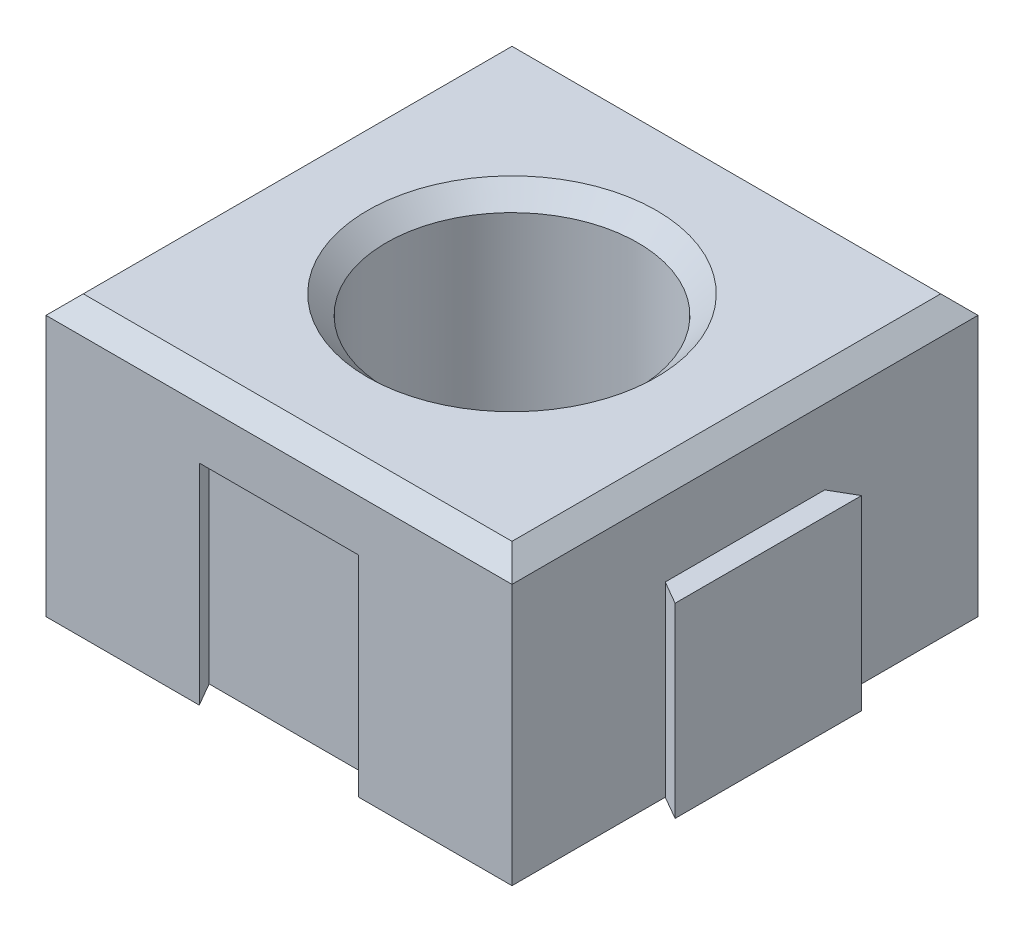
ISO-10303-21;
HEADER;
FILE_DESCRIPTION(('STEP AP214'),'2;1');
FILE_NAME('part.step','',(''),(''),'','','');
FILE_SCHEMA(('AUTOMOTIVE_DESIGN { 1 0 10303 214 1 1 1 1 }'));
ENDSEC;
DATA;
#1=APPLICATION_CONTEXT('core data for automotive mechanical design processes');
#2=APPLICATION_PROTOCOL_DEFINITION('international standard','automotive_design',2000,#1);
#3=PRODUCT_CONTEXT('',#1,'mechanical');
#4=PRODUCT('Part','Part','',(#3));
#5=PRODUCT_RELATED_PRODUCT_CATEGORY('part','',(#4));
#6=PRODUCT_DEFINITION_FORMATION('','',#4);
#7=PRODUCT_DEFINITION_CONTEXT('part definition',#1,'design');
#8=PRODUCT_DEFINITION('design','',#6,#7);
#9=PRODUCT_DEFINITION_SHAPE('','',#8);
#10=(LENGTH_UNIT() NAMED_UNIT(*) SI_UNIT(.MILLI.,.METRE.));
#11=(NAMED_UNIT(*) PLANE_ANGLE_UNIT() SI_UNIT($,.RADIAN.));
#12=(NAMED_UNIT(*) SI_UNIT($,.STERADIAN.) SOLID_ANGLE_UNIT());
#13=UNCERTAINTY_MEASURE_WITH_UNIT(LENGTH_MEASURE(1.E-05),#10,'distance_accuracy_value','');
#14=(GEOMETRIC_REPRESENTATION_CONTEXT(3) GLOBAL_UNCERTAINTY_ASSIGNED_CONTEXT((#13)) GLOBAL_UNIT_ASSIGNED_CONTEXT((#10,
#11,#12)) REPRESENTATION_CONTEXT('',''));
#15=CARTESIAN_POINT('',(0.,0.,0.));
#16=DIRECTION('',(0.,0.,1.));
#17=DIRECTION('',(1.,0.,0.));
#18=AXIS2_PLACEMENT_3D('',#15,#16,#17);
#19=CARTESIAN_POINT('',(0.,30.,-50.));
#20=DIRECTION('',(0.,0.,1.));
#21=DIRECTION('',(1.,0.,0.));
#22=AXIS2_PLACEMENT_3D('',#19,#20,#21);
#23=PLANE('',#22);
#24=DIRECTION('',(0.,-1.,0.));
#25=VECTOR('',#24,1.);
#26=CARTESIAN_POINT('',(0.,30.,-50.));
#27=LINE('',#26,#25);
#28=CARTESIAN_POINT('',(0.,28.,-50.));
#29=VERTEX_POINT('',#28);
#30=CARTESIAN_POINT('',(0.,0.,-50.));
#31=VERTEX_POINT('',#30);
#32=EDGE_CURVE('E326',#29,#31,#27,.T.);
#33=ORIENTED_EDGE('',*,*,#32,.F.);
#34=DIRECTION('',(1.,0.,0.));
#35=VECTOR('',#34,1.);
#36=CARTESIAN_POINT('',(0.,28.,-50.));
#37=LINE('',#36,#35);
#38=CARTESIAN_POINT('',(50.,28.,-50.));
#39=VERTEX_POINT('',#38);
#40=EDGE_CURVE('E346',#29,#39,#37,.T.);
#41=ORIENTED_EDGE('',*,*,#40,.T.);
#42=DIRECTION('',(0.,-1.,0.));
#43=VECTOR('',#42,1.);
#44=CARTESIAN_POINT('',(50.,30.,-50.));
#45=LINE('',#44,#43);
#46=CARTESIAN_POINT('',(50.,0.,-50.));
#47=VERTEX_POINT('',#46);
#48=EDGE_CURVE('E328',#39,#47,#45,.T.);
#49=ORIENTED_EDGE('',*,*,#48,.T.);
#50=DIRECTION('',(-1.,0.,0.));
#51=VECTOR('',#50,1.);
#52=CARTESIAN_POINT('',(0.,0.,-50.));
#53=LINE('',#52,#51);
#54=CARTESIAN_POINT('',(33.556624327026,0.,-50.));
#55=VERTEX_POINT('',#54);
#56=EDGE_CURVE('E323',#47,#55,#53,.T.);
#57=ORIENTED_EDGE('',*,*,#56,.T.);
#58=DIRECTION('',(0.,-1.,0.));
#59=VECTOR('',#58,1.);
#60=CARTESIAN_POINT('',(33.556624327026,20.,-50.));
#61=LINE('',#60,#59);
#62=CARTESIAN_POINT('',(33.556624327026,20.,-50.));
#63=VERTEX_POINT('',#62);
#64=EDGE_CURVE('E276',#63,#55,#61,.T.);
#65=ORIENTED_EDGE('',*,*,#64,.F.);
#66=DIRECTION('',(-1.,0.,0.));
#67=VECTOR('',#66,1.);
#68=CARTESIAN_POINT('',(33.556624327026,20.,-50.));
#69=LINE('',#68,#67);
#70=CARTESIAN_POINT('',(16.443375672974,20.,-50.));
#71=VERTEX_POINT('',#70);
#72=EDGE_CURVE('E261',#63,#71,#69,.T.);
#73=ORIENTED_EDGE('',*,*,#72,.T.);
#74=DIRECTION('',(0.,-1.,0.));
#75=VECTOR('',#74,1.);
#76=CARTESIAN_POINT('',(16.443375672974,20.,-50.));
#77=LINE('',#76,#75);
#78=CARTESIAN_POINT('',(16.443375672974,0.,-50.));
#79=VERTEX_POINT('',#78);
#80=EDGE_CURVE('E272',#71,#79,#77,.T.);
#81=ORIENTED_EDGE('',*,*,#80,.T.);
#82=EDGE_CURVE('E322',#79,#31,#53,.T.);
#83=ORIENTED_EDGE('',*,*,#82,.T.);
#84=EDGE_LOOP('',(#33,#41,#49,#57,#65,#73,#81,#83));
#85=FACE_BOUND('',#84,.T.);
#86=ADVANCED_FACE('F35',(#85),#23,.F.);
#87=CARTESIAN_POINT('',(50.,30.,0.));
#88=DIRECTION('',(-1.,0.,0.));
#89=DIRECTION('',(0.,0.,1.));
#90=AXIS2_PLACEMENT_3D('',#87,#88,#89);
#91=PLANE('',#90);
#92=ORIENTED_EDGE('',*,*,#48,.F.);
#93=DIRECTION('',(0.,0.,1.));
#94=VECTOR('',#93,1.);
#95=CARTESIAN_POINT('',(50.,28.,0.));
#96=LINE('',#95,#94);
#97=CARTESIAN_POINT('',(50.,28.,0.));
#98=VERTEX_POINT('',#97);
#99=EDGE_CURVE('E349',#39,#98,#96,.T.);
#100=ORIENTED_EDGE('',*,*,#99,.T.);
#101=DIRECTION('',(0.,-1.,0.));
#102=VECTOR('',#101,1.);
#103=CARTESIAN_POINT('',(50.,30.,0.));
#104=LINE('',#103,#102);
#105=CARTESIAN_POINT('',(50.,0.,0.));
#106=VERTEX_POINT('',#105);
#107=EDGE_CURVE('E330',#98,#106,#104,.T.);
#108=ORIENTED_EDGE('',*,*,#107,.T.);
#109=DIRECTION('',(0.,0.,-1.));
#110=VECTOR('',#109,1.);
#111=CARTESIAN_POINT('',(50.,0.,0.));
#112=LINE('',#111,#110);
#113=CARTESIAN_POINT('',(50.,0.,-16.443375672974));
#114=VERTEX_POINT('',#113);
#115=EDGE_CURVE('E319',#106,#114,#112,.T.);
#116=ORIENTED_EDGE('',*,*,#115,.T.);
#117=DIRECTION('',(0.,-1.,0.));
#118=VECTOR('',#117,1.);
#119=CARTESIAN_POINT('',(50.,20.,-16.443375672974));
#120=LINE('',#119,#118);
#121=CARTESIAN_POINT('',(50.,20.,-16.443375672974));
#122=VERTEX_POINT('',#121);
#123=EDGE_CURVE('E305',#122,#114,#120,.T.);
#124=ORIENTED_EDGE('',*,*,#123,.F.);
#125=DIRECTION('',(0.,0.,-1.));
#126=VECTOR('',#125,1.);
#127=CARTESIAN_POINT('',(50.,20.,-16.443375672974));
#128=LINE('',#127,#126);
#129=CARTESIAN_POINT('',(50.,20.,-33.556624327026));
#130=VERTEX_POINT('',#129);
#131=EDGE_CURVE('E290',#122,#130,#128,.T.);
#132=ORIENTED_EDGE('',*,*,#131,.T.);
#133=DIRECTION('',(0.,-1.,0.));
#134=VECTOR('',#133,1.);
#135=CARTESIAN_POINT('',(50.,20.,-33.556624327026));
#136=LINE('',#135,#134);
#137=CARTESIAN_POINT('',(50.,0.,-33.556624327026));
#138=VERTEX_POINT('',#137);
#139=EDGE_CURVE('E301',#130,#138,#136,.T.);
#140=ORIENTED_EDGE('',*,*,#139,.T.);
#141=EDGE_CURVE('E318',#138,#47,#112,.T.);
#142=ORIENTED_EDGE('',*,*,#141,.T.);
#143=EDGE_LOOP('',(#92,#100,#108,#116,#124,#132,#140,#142));
#144=FACE_BOUND('',#143,.T.);
#145=ADVANCED_FACE('F442',(#144),#91,.F.);
#146=CARTESIAN_POINT('',(0.,30.,0.));
#147=DIRECTION('',(1.,0.,0.));
#148=DIRECTION('',(0.,0.,-1.));
#149=AXIS2_PLACEMENT_3D('',#146,#147,#148);
#150=PLANE('',#149);
#151=DIRECTION('',(0.,0.,1.));
#152=VECTOR('',#151,1.);
#153=CARTESIAN_POINT('',(0.,22.5,-16.4433756729741));
#154=LINE('',#153,#152);
#155=CARTESIAN_POINT('',(0.,22.5,-33.5566243270259));
#156=VERTEX_POINT('',#155);
#157=CARTESIAN_POINT('',(0.,22.5,-16.4433756729741));
#158=VERTEX_POINT('',#157);
#159=EDGE_CURVE('E205',#156,#158,#154,.T.);
#160=ORIENTED_EDGE('',*,*,#159,.T.);
#161=DIRECTION('',(0.,-1.,0.));
#162=VECTOR('',#161,1.);
#163=CARTESIAN_POINT('',(0.,20.,-16.4433756729741));
#164=LINE('',#163,#162);
#165=CARTESIAN_POINT('',(0.,0.,-16.4433756729741));
#166=VERTEX_POINT('',#165);
#167=EDGE_CURVE('E245',#158,#166,#164,.T.);
#168=ORIENTED_EDGE('',*,*,#167,.T.);
#169=DIRECTION('',(0.,0.,1.));
#170=VECTOR('',#169,1.);
#171=CARTESIAN_POINT('',(0.,0.,0.));
#172=LINE('',#171,#170);
#173=CARTESIAN_POINT('',(0.,0.,0.));
#174=VERTEX_POINT('',#173);
#175=EDGE_CURVE('E312',#166,#174,#172,.T.);
#176=ORIENTED_EDGE('',*,*,#175,.T.);
#177=DIRECTION('',(0.,-1.,0.));
#178=VECTOR('',#177,1.);
#179=CARTESIAN_POINT('',(0.,30.,0.));
#180=LINE('',#179,#178);
#181=CARTESIAN_POINT('',(0.,28.,0.));
#182=VERTEX_POINT('',#181);
#183=EDGE_CURVE('E332',#182,#174,#180,.T.);
#184=ORIENTED_EDGE('',*,*,#183,.F.);
#185=DIRECTION('',(0.,0.,-1.));
#186=VECTOR('',#185,1.);
#187=CARTESIAN_POINT('',(0.,28.,0.));
#188=LINE('',#187,#186);
#189=EDGE_CURVE('E353',#182,#29,#188,.T.);
#190=ORIENTED_EDGE('',*,*,#189,.T.);
#191=ORIENTED_EDGE('',*,*,#32,.T.);
#192=CARTESIAN_POINT('',(0.,0.,-33.5566243270259));
#193=VERTEX_POINT('',#192);
#194=EDGE_CURVE('E313',#31,#193,#172,.T.);
#195=ORIENTED_EDGE('',*,*,#194,.T.);
#196=DIRECTION('',(0.,-1.,0.));
#197=VECTOR('',#196,1.);
#198=CARTESIAN_POINT('',(0.,20.,-33.5566243270259));
#199=LINE('',#198,#197);
#200=EDGE_CURVE('E242',#156,#193,#199,.T.);
#201=ORIENTED_EDGE('',*,*,#200,.F.);
#202=EDGE_LOOP('',(#160,#168,#176,#184,#190,#191,#195,#201));
#203=FACE_BOUND('',#202,.T.);
#204=ADVANCED_FACE('F449',(#203),#150,.F.);
#205=CARTESIAN_POINT('',(0.,30.,0.));
#206=DIRECTION('',(0.,0.,-1.));
#207=DIRECTION('',(-1.,0.,0.));
#208=AXIS2_PLACEMENT_3D('',#205,#206,#207);
#209=PLANE('',#208);
#210=DIRECTION('',(1.,0.,0.));
#211=VECTOR('',#210,1.);
#212=CARTESIAN_POINT('',(33.556624327026,22.5,0.));
#213=LINE('',#212,#211);
#214=CARTESIAN_POINT('',(16.4433756729741,22.5,0.));
#215=VERTEX_POINT('',#214);
#216=CARTESIAN_POINT('',(33.556624327026,22.5,0.));
#217=VERTEX_POINT('',#216);
#218=EDGE_CURVE('E203',#215,#217,#213,.T.);
#219=ORIENTED_EDGE('',*,*,#218,.T.);
#220=DIRECTION('',(0.,-1.,0.));
#221=VECTOR('',#220,1.);
#222=CARTESIAN_POINT('',(33.556624327026,20.,0.));
#223=LINE('',#222,#221);
#224=CARTESIAN_POINT('',(33.556624327026,0.,0.));
#225=VERTEX_POINT('',#224);
#226=EDGE_CURVE('E51',#217,#225,#223,.T.);
#227=ORIENTED_EDGE('',*,*,#226,.T.);
#228=DIRECTION('',(1.,0.,0.));
#229=VECTOR('',#228,1.);
#230=CARTESIAN_POINT('',(0.,0.,0.));
#231=LINE('',#230,#229);
#232=EDGE_CURVE('E225',#225,#106,#231,.T.);
#233=ORIENTED_EDGE('',*,*,#232,.T.);
#234=ORIENTED_EDGE('',*,*,#107,.F.);
#235=DIRECTION('',(-1.,0.,0.));
#236=VECTOR('',#235,1.);
#237=CARTESIAN_POINT('',(0.,28.,0.));
#238=LINE('',#237,#236);
#239=EDGE_CURVE('E351',#98,#182,#238,.T.);
#240=ORIENTED_EDGE('',*,*,#239,.T.);
#241=ORIENTED_EDGE('',*,*,#183,.T.);
#242=CARTESIAN_POINT('',(16.4433756729741,0.,0.));
#243=VERTEX_POINT('',#242);
#244=EDGE_CURVE('E316',#174,#243,#231,.T.);
#245=ORIENTED_EDGE('',*,*,#244,.T.);
#246=DIRECTION('',(0.,-1.,0.));
#247=VECTOR('',#246,1.);
#248=CARTESIAN_POINT('',(16.4433756729741,20.,0.));
#249=LINE('',#248,#247);
#250=EDGE_CURVE('E59',#215,#243,#249,.T.);
#251=ORIENTED_EDGE('',*,*,#250,.F.);
#252=EDGE_LOOP('',(#219,#227,#233,#234,#240,#241,#245,#251));
#253=FACE_BOUND('',#252,.T.);
#254=ADVANCED_FACE('F456',(#253),#209,.F.);
#255=CARTESIAN_POINT('',(0.,30.,0.));
#256=DIRECTION('',(0.,-1.,0.));
#257=DIRECTION('',(0.,0.,-1.));
#258=AXIS2_PLACEMENT_3D('',#255,#256,#257);
#259=PLANE('',#258);
#260=DIRECTION('',(0.,0.,-1.));
#261=VECTOR('',#260,1.);
#262=CARTESIAN_POINT('',(48.,30.,0.));
#263=LINE('',#262,#261);
#264=CARTESIAN_POINT('',(48.,30.,-2.00000000000001));
#265=VERTEX_POINT('',#264);
#266=CARTESIAN_POINT('',(48.,30.,-48.));
#267=VERTEX_POINT('',#266);
#268=EDGE_CURVE('E341',#265,#267,#263,.T.);
#269=ORIENTED_EDGE('',*,*,#268,.T.);
#270=DIRECTION('',(-1.,0.,0.));
#271=VECTOR('',#270,1.);
#272=CARTESIAN_POINT('',(0.,30.,-48.));
#273=LINE('',#272,#271);
#274=CARTESIAN_POINT('',(2.00000000000001,30.,-48.));
#275=VERTEX_POINT('',#274);
#276=EDGE_CURVE('E343',#267,#275,#273,.T.);
#277=ORIENTED_EDGE('',*,*,#276,.T.);
#278=DIRECTION('',(0.,0.,1.));
#279=VECTOR('',#278,1.);
#280=CARTESIAN_POINT('',(2.00000000000001,30.,0.));
#281=LINE('',#280,#279);
#282=CARTESIAN_POINT('',(2.00000000000001,30.,-2.00000000000001));
#283=VERTEX_POINT('',#282);
#284=EDGE_CURVE('E337',#275,#283,#281,.T.);
#285=ORIENTED_EDGE('',*,*,#284,.T.);
#286=DIRECTION('',(1.,0.,0.));
#287=VECTOR('',#286,1.);
#288=CARTESIAN_POINT('',(0.,30.,-2.00000000000001));
#289=LINE('',#288,#287);
#290=EDGE_CURVE('E339',#283,#265,#289,.T.);
#291=ORIENTED_EDGE('',*,*,#290,.T.);
#292=EDGE_LOOP('',(#269,#277,#285,#291));
#293=FACE_BOUND('',#292,.T.);
#294=CARTESIAN_POINT('',(25.,30.,-25.));
#295=DIRECTION('',(0.,-1.,0.));
#296=DIRECTION('',(0.,0.,-1.));
#297=AXIS2_PLACEMENT_3D('',#294,#295,#296);
#298=CIRCLE('',#297,15.5000000000001);
#299=CARTESIAN_POINT('',(25.,30.,-40.5000000000001));
#300=VERTEX_POINT('',#299);
#301=EDGE_CURVE('E334',#300,#300,#298,.T.);
#302=ORIENTED_EDGE('',*,*,#301,.T.);
#303=EDGE_LOOP('',(#302));
#304=FACE_BOUND('',#303,.T.);
#305=ADVANCED_FACE('F459',(#293,#304),#259,.F.);
#306=CARTESIAN_POINT('',(0.,0.,0.));
#307=DIRECTION('',(0.,-1.,0.));
#308=DIRECTION('',(0.,0.,-1.));
#309=AXIS2_PLACEMENT_3D('',#306,#307,#308);
#310=PLANE('',#309);
#311=CARTESIAN_POINT('',(12.5,0.,-12.5));
#312=DIRECTION('',(0.,1.,0.));
#313=DIRECTION('',(0.,0.,1.));
#314=AXIS2_PLACEMENT_3D('',#311,#312,#313);
#315=CIRCLE('',#314,3.1);
#316=CARTESIAN_POINT('',(12.5,0.,-9.4));
#317=VERTEX_POINT('',#316);
#318=EDGE_CURVE('E416',#317,#317,#315,.T.);
#319=ORIENTED_EDGE('',*,*,#318,.T.);
#320=EDGE_LOOP('',(#319));
#321=FACE_BOUND('',#320,.T.);
#322=CARTESIAN_POINT('',(37.5,0.,-12.5));
#323=DIRECTION('',(0.,1.,0.));
#324=DIRECTION('',(0.,0.,1.));
#325=AXIS2_PLACEMENT_3D('',#322,#323,#324);
#326=CIRCLE('',#325,3.1);
#327=CARTESIAN_POINT('',(37.5,0.,-9.4));
#328=VERTEX_POINT('',#327);
#329=EDGE_CURVE('E411',#328,#328,#326,.T.);
#330=ORIENTED_EDGE('',*,*,#329,.T.);
#331=EDGE_LOOP('',(#330));
#332=FACE_BOUND('',#331,.T.);
#333=CARTESIAN_POINT('',(37.5,0.,-37.5));
#334=DIRECTION('',(0.,1.,0.));
#335=DIRECTION('',(0.,0.,1.));
#336=AXIS2_PLACEMENT_3D('',#333,#334,#335);
#337=CIRCLE('',#336,3.1);
#338=CARTESIAN_POINT('',(37.5,0.,-34.4));
#339=VERTEX_POINT('',#338);
#340=EDGE_CURVE('E409',#339,#339,#337,.T.);
#341=ORIENTED_EDGE('',*,*,#340,.T.);
#342=EDGE_LOOP('',(#341));
#343=FACE_BOUND('',#342,.T.);
#344=CARTESIAN_POINT('',(12.5,0.,-37.5));
#345=DIRECTION('',(0.,1.,0.));
#346=DIRECTION('',(0.,0.,1.));
#347=AXIS2_PLACEMENT_3D('',#344,#345,#346);
#348=CIRCLE('',#347,3.1);
#349=CARTESIAN_POINT('',(12.5,0.,-34.4));
#350=VERTEX_POINT('',#349);
#351=EDGE_CURVE('E362',#350,#350,#348,.T.);
#352=ORIENTED_EDGE('',*,*,#351,.T.);
#353=EDGE_LOOP('',(#352));
#354=FACE_BOUND('',#353,.T.);
#355=DIRECTION('',(-0.499999999999995,0.,-0.866025403784441));
#356=VECTOR('',#355,1.);
#357=CARTESIAN_POINT('',(16.4433756729741,0.,0.));
#358=LINE('',#357,#356);
#359=CARTESIAN_POINT('',(15.,0.,-2.5));
#360=VERTEX_POINT('',#359);
#361=EDGE_CURVE('E190',#243,#360,#358,.T.);
#362=ORIENTED_EDGE('',*,*,#361,.F.);
#363=ORIENTED_EDGE('',*,*,#244,.F.);
#364=ORIENTED_EDGE('',*,*,#175,.F.);
#365=DIRECTION('',(-0.866025403784438,0.,-0.500000000000001));
#366=VECTOR('',#365,1.);
#367=CARTESIAN_POINT('',(2.5,0.,-15.));
#368=LINE('',#367,#366);
#369=CARTESIAN_POINT('',(2.5,0.,-15.));
#370=VERTEX_POINT('',#369);
#371=EDGE_CURVE('E236',#370,#166,#368,.T.);
#372=ORIENTED_EDGE('',*,*,#371,.F.);
#373=DIRECTION('',(0.,0.,1.));
#374=VECTOR('',#373,1.);
#375=CARTESIAN_POINT('',(2.5,0.,-35.));
#376=LINE('',#375,#374);
#377=CARTESIAN_POINT('',(2.5,0.,-35.));
#378=VERTEX_POINT('',#377);
#379=EDGE_CURVE('E238',#378,#370,#376,.T.);
#380=ORIENTED_EDGE('',*,*,#379,.F.);
#381=DIRECTION('',(0.866025403784438,0.,-0.500000000000001));
#382=VECTOR('',#381,1.);
#383=CARTESIAN_POINT('',(0.,0.,-33.5566243270259));
#384=LINE('',#383,#382);
#385=EDGE_CURVE('E230',#193,#378,#384,.T.);
#386=ORIENTED_EDGE('',*,*,#385,.F.);
#387=ORIENTED_EDGE('',*,*,#194,.F.);
#388=ORIENTED_EDGE('',*,*,#82,.F.);
#389=DIRECTION('',(-0.499999999999989,0.,-0.866025403784445));
#390=VECTOR('',#389,1.);
#391=CARTESIAN_POINT('',(16.443375672974,0.,-50.));
#392=LINE('',#391,#390);
#393=CARTESIAN_POINT('',(15.,0.,-52.5));
#394=VERTEX_POINT('',#393);
#395=EDGE_CURVE('E244',#79,#394,#392,.T.);
#396=ORIENTED_EDGE('',*,*,#395,.T.);
#397=DIRECTION('',(1.,0.,0.));
#398=VECTOR('',#397,1.);
#399=CARTESIAN_POINT('',(15.,0.,-52.5));
#400=LINE('',#399,#398);
#401=CARTESIAN_POINT('',(35.,0.,-52.5));
#402=VERTEX_POINT('',#401);
#403=EDGE_CURVE('E267',#394,#402,#400,.T.);
#404=ORIENTED_EDGE('',*,*,#403,.T.);
#405=DIRECTION('',(-0.499999999999989,0.,0.866025403784445));
#406=VECTOR('',#405,1.);
#407=CARTESIAN_POINT('',(35.,0.,-52.5));
#408=LINE('',#407,#406);
#409=EDGE_CURVE('E256',#402,#55,#408,.T.);
#410=ORIENTED_EDGE('',*,*,#409,.T.);
#411=ORIENTED_EDGE('',*,*,#56,.F.);
#412=ORIENTED_EDGE('',*,*,#141,.F.);
#413=DIRECTION('',(0.866025403784438,0.,-0.5));
#414=VECTOR('',#413,1.);
#415=CARTESIAN_POINT('',(50.,0.,-33.556624327026));
#416=LINE('',#415,#414);
#417=CARTESIAN_POINT('',(52.5,0.,-35.));
#418=VERTEX_POINT('',#417);
#419=EDGE_CURVE('E275',#138,#418,#416,.T.);
#420=ORIENTED_EDGE('',*,*,#419,.T.);
#421=DIRECTION('',(0.,0.,1.));
#422=VECTOR('',#421,1.);
#423=CARTESIAN_POINT('',(52.5,0.,-35.));
#424=LINE('',#423,#422);
#425=CARTESIAN_POINT('',(52.5,0.,-15.));
#426=VERTEX_POINT('',#425);
#427=EDGE_CURVE('E296',#418,#426,#424,.T.);
#428=ORIENTED_EDGE('',*,*,#427,.T.);
#429=DIRECTION('',(-0.866025403784439,0.,-0.499999999999999));
#430=VECTOR('',#429,1.);
#431=CARTESIAN_POINT('',(52.5,0.,-15.));
#432=LINE('',#431,#430);
#433=EDGE_CURVE('E285',#426,#114,#432,.T.);
#434=ORIENTED_EDGE('',*,*,#433,.T.);
#435=ORIENTED_EDGE('',*,*,#115,.F.);
#436=ORIENTED_EDGE('',*,*,#232,.F.);
#437=DIRECTION('',(-0.499999999999996,0.,0.866025403784441));
#438=VECTOR('',#437,1.);
#439=CARTESIAN_POINT('',(35.,0.,-2.5));
#440=LINE('',#439,#438);
#441=CARTESIAN_POINT('',(35.,0.,-2.5));
#442=VERTEX_POINT('',#441);
#443=EDGE_CURVE('E201',#442,#225,#440,.T.);
#444=ORIENTED_EDGE('',*,*,#443,.F.);
#445=DIRECTION('',(1.,0.,0.));
#446=VECTOR('',#445,1.);
#447=CARTESIAN_POINT('',(15.,0.,-2.5));
#448=LINE('',#447,#446);
#449=EDGE_CURVE('E218',#360,#442,#448,.T.);
#450=ORIENTED_EDGE('',*,*,#449,.F.);
#451=EDGE_LOOP('',(#362,#363,#364,#372,#380,#386,#387,#388,#396,#404,#410,#411,#412,#420,#428,
#434,#435,#436,#444,#450));
#452=FACE_BOUND('',#451,.T.);
#453=ADVANCED_FACE('F222',(#321,#332,#343,#354,#452),#310,.T.);
#454=CARTESIAN_POINT('',(25.,4.,-25.));
#455=DIRECTION('',(0.,1.,0.));
#456=DIRECTION('',(0.,0.,1.));
#457=AXIS2_PLACEMENT_3D('',#454,#455,#456);
#458=CYLINDRICAL_SURFACE('',#457,13.5);
#459=CARTESIAN_POINT('',(25.,28.,-25.));
#460=DIRECTION('',(0.,-1.,0.));
#461=DIRECTION('',(0.,0.,-1.));
#462=AXIS2_PLACEMENT_3D('',#459,#460,#461);
#463=CIRCLE('',#462,13.5);
#464=CARTESIAN_POINT('',(25.,28.,-11.5));
#465=VERTEX_POINT('',#464);
#466=EDGE_CURVE('E355',#465,#465,#463,.F.);
#467=CARTESIAN_POINT('',(25.,4.,-25.));
#468=DIRECTION('',(0.,1.,0.));
#469=DIRECTION('',(0.,0.,1.));
#470=AXIS2_PLACEMENT_3D('',#467,#468,#469);
#471=CIRCLE('',#470,13.5);
#472=CARTESIAN_POINT('',(25.,4.,-11.5));
#473=VERTEX_POINT('',#472);
#474=EDGE_CURVE('E304',#473,#473,#471,.T.);
#475=CARTESIAN_POINT('',(25.,28.,-11.5));
#476=CARTESIAN_POINT('',(25.,27.75,-11.5));
#477=CARTESIAN_POINT('',(25.,27.5,-11.5));
#478=CARTESIAN_POINT('',(25.,27.,-11.5));
#479=CARTESIAN_POINT('',(25.,26.75,-11.5));
#480=CARTESIAN_POINT('',(25.,26.25,-11.5));
#481=CARTESIAN_POINT('',(25.,26.,-11.5));
#482=CARTESIAN_POINT('',(25.,25.5,-11.5));
#483=CARTESIAN_POINT('',(25.,25.25,-11.5));
#484=CARTESIAN_POINT('',(25.,24.75,-11.5));
#485=CARTESIAN_POINT('',(25.,24.5,-11.5));
#486=CARTESIAN_POINT('',(25.,24.,-11.5));
#487=CARTESIAN_POINT('',(25.,23.75,-11.5));
#488=CARTESIAN_POINT('',(25.,23.25,-11.5));
#489=CARTESIAN_POINT('',(25.,23.,-11.5));
#490=CARTESIAN_POINT('',(25.,22.5,-11.5));
#491=CARTESIAN_POINT('',(25.,22.25,-11.5));
#492=CARTESIAN_POINT('',(25.,21.75,-11.5));
#493=CARTESIAN_POINT('',(25.,21.5,-11.5));
#494=CARTESIAN_POINT('',(25.,21.,-11.5));
#495=CARTESIAN_POINT('',(25.,20.75,-11.5));
#496=CARTESIAN_POINT('',(25.,20.25,-11.5));
#497=CARTESIAN_POINT('',(25.,20.,-11.5));
#498=CARTESIAN_POINT('',(25.,19.5,-11.5));
#499=CARTESIAN_POINT('',(25.,19.25,-11.5));
#500=CARTESIAN_POINT('',(25.,18.75,-11.5));
#501=CARTESIAN_POINT('',(25.,18.5,-11.5));
#502=CARTESIAN_POINT('',(25.,18.,-11.5));
#503=CARTESIAN_POINT('',(25.,17.75,-11.5));
#504=CARTESIAN_POINT('',(25.,17.25,-11.5));
#505=CARTESIAN_POINT('',(25.,17.,-11.5));
#506=CARTESIAN_POINT('',(25.,16.5,-11.5));
#507=CARTESIAN_POINT('',(25.,16.25,-11.5));
#508=CARTESIAN_POINT('',(25.,15.75,-11.5));
#509=CARTESIAN_POINT('',(25.,15.5,-11.5));
#510=CARTESIAN_POINT('',(25.,15.,-11.5));
#511=CARTESIAN_POINT('',(25.,14.75,-11.5));
#512=CARTESIAN_POINT('',(25.,14.25,-11.5));
#513=CARTESIAN_POINT('',(25.,14.,-11.5));
#514=CARTESIAN_POINT('',(25.,13.5,-11.5));
#515=CARTESIAN_POINT('',(25.,13.25,-11.5));
#516=CARTESIAN_POINT('',(25.,12.75,-11.5));
#517=CARTESIAN_POINT('',(25.,12.5,-11.5));
#518=CARTESIAN_POINT('',(25.,12.,-11.5));
#519=CARTESIAN_POINT('',(25.,11.75,-11.5));
#520=CARTESIAN_POINT('',(25.,11.25,-11.5));
#521=CARTESIAN_POINT('',(25.,11.,-11.5));
#522=CARTESIAN_POINT('',(25.,10.5,-11.5));
#523=CARTESIAN_POINT('',(25.,10.25,-11.5));
#524=CARTESIAN_POINT('',(25.,9.74999999999999,-11.5));
#525=CARTESIAN_POINT('',(25.,9.49999999999999,-11.5));
#526=CARTESIAN_POINT('',(25.,8.99999999999999,-11.5));
#527=CARTESIAN_POINT('',(25.,8.74999999999999,-11.5));
#528=CARTESIAN_POINT('',(25.,8.24999999999999,-11.5));
#529=CARTESIAN_POINT('',(25.,7.99999999999999,-11.5));
#530=CARTESIAN_POINT('',(25.,7.49999999999999,-11.5));
#531=CARTESIAN_POINT('',(25.,7.25,-11.5));
#532=CARTESIAN_POINT('',(25.,6.75,-11.5));
#533=CARTESIAN_POINT('',(25.,6.5,-11.5));
#534=CARTESIAN_POINT('',(25.,6.,-11.5));
#535=CARTESIAN_POINT('',(25.,5.75,-11.5));
#536=CARTESIAN_POINT('',(25.,5.25,-11.5));
#537=CARTESIAN_POINT('',(25.,5.,-11.5));
#538=CARTESIAN_POINT('',(25.,4.5,-11.5));
#539=CARTESIAN_POINT('',(25.,4.25,-11.5));
#540=CARTESIAN_POINT('',(25.,4.,-11.5));
#541=B_SPLINE_CURVE_WITH_KNOTS('',3,(#475,#476,#477,#478,#479,#480,#481,#482,#483,#484,#485,
#486,#487,#488,#489,#490,#491,#492,#493,#494,#495,#496,#497,#498,#499,#500,#501,#502,#503,#504,
#505,#506,#507,#508,#509,#510,#511,#512,#513,#514,#515,#516,#517,#518,#519,#520,#521,#522,#523,
#524,#525,#526,#527,#528,#529,#530,#531,#532,#533,#534,#535,#536,#537,#538,#539,#540),
.UNSPECIFIED.,.F.,.F.,(4,2,2,2,2,2,2,2,2,2,2,2,2,2,2,2,2,2,2,2,2,2,2,2,2,2,2,2,2,2,2,2,4),(0.,
0.749999999999997,1.5,2.25,3.,3.74999999999999,4.49999999999999,5.24999999999999,
5.99999999999999,6.74999999999999,7.49999999999999,8.24999999999999,8.99999999999998,
9.74999999999998,10.5,11.25,12.,12.75,13.5,14.25,15.,15.75,16.5,17.25,18.,18.75,19.5,20.25,21.,
21.75,22.5,23.25,24.),.UNSPECIFIED.);
#542=EDGE_CURVE('BSEAM610',#465,#473,#541,.T.);
#543=ORIENTED_EDGE('',*,*,#466,.T.);
#544=ORIENTED_EDGE('',*,*,#474,.F.);
#545=ORIENTED_EDGE('',*,*,#542,.T.);
#546=ORIENTED_EDGE('',*,*,#542,.F.);
#547=EDGE_LOOP('',(#543,#545,#544,#546));
#548=FACE_BOUND('',#547,.T.);
#549=ADVANCED_FACE('F610',(#548),#458,.F.);
#550=CARTESIAN_POINT('',(25.,4.,-25.));
#551=DIRECTION('',(0.,1.,0.));
#552=DIRECTION('',(0.,0.,1.));
#553=AXIS2_PLACEMENT_3D('',#550,#551,#552);
#554=PLANE('',#553);
#555=ORIENTED_EDGE('',*,*,#474,.T.);
#556=EDGE_LOOP('',(#555));
#557=FACE_BOUND('',#556,.T.);
#558=ADVANCED_FACE('F606',(#557),#554,.T.);
#559=CARTESIAN_POINT('',(50.,20.,-33.556624327026));
#560=DIRECTION('',(-0.5,0.,-0.866025403784438));
#561=DIRECTION('',(-0.866025403784438,0.,0.5));
#562=AXIS2_PLACEMENT_3D('',#559,#560,#561);
#563=PLANE('',#562);
#564=ORIENTED_EDGE('',*,*,#419,.F.);
#565=ORIENTED_EDGE('',*,*,#139,.F.);
#566=DIRECTION('',(0.866025403784438,0.,-0.5));
#567=VECTOR('',#566,1.);
#568=CARTESIAN_POINT('',(50.,20.,-33.556624327026));
#569=LINE('',#568,#567);
#570=CARTESIAN_POINT('',(52.5,20.,-35.));
#571=VERTEX_POINT('',#570);
#572=EDGE_CURVE('E281',#130,#571,#569,.T.);
#573=ORIENTED_EDGE('',*,*,#572,.T.);
#574=DIRECTION('',(0.,-1.,0.));
#575=VECTOR('',#574,1.);
#576=CARTESIAN_POINT('',(52.5,20.,-35.));
#577=LINE('',#576,#575);
#578=EDGE_CURVE('E293',#571,#418,#577,.T.);
#579=ORIENTED_EDGE('',*,*,#578,.T.);
#580=EDGE_LOOP('',(#564,#565,#573,#579));
#581=FACE_BOUND('',#580,.T.);
#582=ADVANCED_FACE('F599',(#581),#563,.T.);
#583=CARTESIAN_POINT('',(52.5,20.,-15.));
#584=DIRECTION('',(-0.5,0.,0.866025403784439));
#585=DIRECTION('',(0.866025403784439,0.,0.5));
#586=AXIS2_PLACEMENT_3D('',#583,#584,#585);
#587=PLANE('',#586);
#588=ORIENTED_EDGE('',*,*,#433,.F.);
#589=DIRECTION('',(0.,-1.,0.));
#590=VECTOR('',#589,1.);
#591=CARTESIAN_POINT('',(52.5,20.,-15.));
#592=LINE('',#591,#590);
#593=CARTESIAN_POINT('',(52.5,20.,-15.));
#594=VERTEX_POINT('',#593);
#595=EDGE_CURVE('E307',#594,#426,#592,.T.);
#596=ORIENTED_EDGE('',*,*,#595,.F.);
#597=DIRECTION('',(-0.866025403784439,0.,-0.499999999999999));
#598=VECTOR('',#597,1.);
#599=CARTESIAN_POINT('',(52.5,20.,-15.));
#600=LINE('',#599,#598);
#601=EDGE_CURVE('E288',#594,#122,#600,.T.);
#602=ORIENTED_EDGE('',*,*,#601,.T.);
#603=ORIENTED_EDGE('',*,*,#123,.T.);
#604=EDGE_LOOP('',(#588,#596,#602,#603));
#605=FACE_BOUND('',#604,.T.);
#606=ADVANCED_FACE('F596',(#605),#587,.T.);
#607=CARTESIAN_POINT('',(52.5,20.,-35.));
#608=DIRECTION('',(1.,0.,0.));
#609=DIRECTION('',(0.,0.,-1.));
#610=AXIS2_PLACEMENT_3D('',#607,#608,#609);
#611=PLANE('',#610);
#612=ORIENTED_EDGE('',*,*,#427,.F.);
#613=ORIENTED_EDGE('',*,*,#578,.F.);
#614=DIRECTION('',(0.,0.,1.));
#615=VECTOR('',#614,1.);
#616=CARTESIAN_POINT('',(52.5,20.,-35.));
#617=LINE('',#616,#615);
#618=EDGE_CURVE('E284',#571,#594,#617,.T.);
#619=ORIENTED_EDGE('',*,*,#618,.T.);
#620=ORIENTED_EDGE('',*,*,#595,.T.);
#621=EDGE_LOOP('',(#612,#613,#619,#620));
#622=FACE_BOUND('',#621,.T.);
#623=ADVANCED_FACE('F594',(#622),#611,.T.);
#624=CARTESIAN_POINT('',(0.,20.,0.));
#625=DIRECTION('',(0.,-1.,0.));
#626=DIRECTION('',(0.,0.,-1.));
#627=AXIS2_PLACEMENT_3D('',#624,#625,#626);
#628=PLANE('',#627);
#629=ORIENTED_EDGE('',*,*,#572,.F.);
#630=ORIENTED_EDGE('',*,*,#131,.F.);
#631=ORIENTED_EDGE('',*,*,#601,.F.);
#632=ORIENTED_EDGE('',*,*,#618,.F.);
#633=EDGE_LOOP('',(#629,#630,#631,#632));
#634=FACE_BOUND('',#633,.T.);
#635=ADVANCED_FACE('F591',(#634),#628,.F.);
#636=CARTESIAN_POINT('',(16.443375672974,20.,-50.));
#637=DIRECTION('',(-0.866025403784445,0.,0.499999999999989));
#638=DIRECTION('',(0.499999999999989,0.,0.866025403784445));
#639=AXIS2_PLACEMENT_3D('',#636,#637,#638);
#640=PLANE('',#639);
#641=ORIENTED_EDGE('',*,*,#395,.F.);
#642=ORIENTED_EDGE('',*,*,#80,.F.);
#643=DIRECTION('',(-0.499999999999989,0.,-0.866025403784445));
#644=VECTOR('',#643,1.);
#645=CARTESIAN_POINT('',(16.443375672974,20.,-50.));
#646=LINE('',#645,#644);
#647=CARTESIAN_POINT('',(15.,20.,-52.5));
#648=VERTEX_POINT('',#647);
#649=EDGE_CURVE('E252',#71,#648,#646,.T.);
#650=ORIENTED_EDGE('',*,*,#649,.T.);
#651=DIRECTION('',(0.,-1.,0.));
#652=VECTOR('',#651,1.);
#653=CARTESIAN_POINT('',(15.,20.,-52.5));
#654=LINE('',#653,#652);
#655=EDGE_CURVE('E264',#648,#394,#654,.T.);
#656=ORIENTED_EDGE('',*,*,#655,.T.);
#657=EDGE_LOOP('',(#641,#642,#650,#656));
#658=FACE_BOUND('',#657,.T.);
#659=ADVANCED_FACE('F576',(#658),#640,.T.);
#660=CARTESIAN_POINT('',(35.,20.,-52.5));
#661=DIRECTION('',(0.866025403784445,0.,0.499999999999989));
#662=DIRECTION('',(0.499999999999989,0.,-0.866025403784445));
#663=AXIS2_PLACEMENT_3D('',#660,#661,#662);
#664=PLANE('',#663);
#665=ORIENTED_EDGE('',*,*,#409,.F.);
#666=DIRECTION('',(0.,-1.,0.));
#667=VECTOR('',#666,1.);
#668=CARTESIAN_POINT('',(35.,20.,-52.5));
#669=LINE('',#668,#667);
#670=CARTESIAN_POINT('',(35.,20.,-52.5));
#671=VERTEX_POINT('',#670);
#672=EDGE_CURVE('E278',#671,#402,#669,.T.);
#673=ORIENTED_EDGE('',*,*,#672,.F.);
#674=DIRECTION('',(-0.499999999999989,0.,0.866025403784445));
#675=VECTOR('',#674,1.);
#676=CARTESIAN_POINT('',(35.,20.,-52.5));
#677=LINE('',#676,#675);
#678=EDGE_CURVE('E259',#671,#63,#677,.T.);
#679=ORIENTED_EDGE('',*,*,#678,.T.);
#680=ORIENTED_EDGE('',*,*,#64,.T.);
#681=EDGE_LOOP('',(#665,#673,#679,#680));
#682=FACE_BOUND('',#681,.T.);
#683=ADVANCED_FACE('F569',(#682),#664,.T.);
#684=CARTESIAN_POINT('',(15.,20.,-52.5));
#685=DIRECTION('',(0.,0.,-1.));
#686=DIRECTION('',(-1.,0.,0.));
#687=AXIS2_PLACEMENT_3D('',#684,#685,#686);
#688=PLANE('',#687);
#689=ORIENTED_EDGE('',*,*,#403,.F.);
#690=ORIENTED_EDGE('',*,*,#655,.F.);
#691=DIRECTION('',(1.,0.,0.));
#692=VECTOR('',#691,1.);
#693=CARTESIAN_POINT('',(15.,20.,-52.5));
#694=LINE('',#693,#692);
#695=EDGE_CURVE('E255',#648,#671,#694,.T.);
#696=ORIENTED_EDGE('',*,*,#695,.T.);
#697=ORIENTED_EDGE('',*,*,#672,.T.);
#698=EDGE_LOOP('',(#689,#690,#696,#697));
#699=FACE_BOUND('',#698,.T.);
#700=ADVANCED_FACE('F579',(#699),#688,.T.);
#701=CARTESIAN_POINT('',(0.,20.,0.));
#702=DIRECTION('',(0.,-1.,0.));
#703=DIRECTION('',(0.,0.,-1.));
#704=AXIS2_PLACEMENT_3D('',#701,#702,#703);
#705=PLANE('',#704);
#706=ORIENTED_EDGE('',*,*,#649,.F.);
#707=ORIENTED_EDGE('',*,*,#72,.F.);
#708=ORIENTED_EDGE('',*,*,#678,.F.);
#709=ORIENTED_EDGE('',*,*,#695,.F.);
#710=EDGE_LOOP('',(#706,#707,#708,#709));
#711=FACE_BOUND('',#710,.T.);
#712=ADVANCED_FACE('F574',(#711),#705,.F.);
#713=CARTESIAN_POINT('',(0.,20.,-33.5566243270259));
#714=DIRECTION('',(-0.500000000000001,0.,-0.866025403784438));
#715=DIRECTION('',(-0.866025403784438,0.,0.500000000000001));
#716=AXIS2_PLACEMENT_3D('',#713,#714,#715);
#717=PLANE('',#716);
#718=ORIENTED_EDGE('',*,*,#385,.T.);
#719=DIRECTION('',(0.,-1.,0.));
#720=VECTOR('',#719,1.);
#721=CARTESIAN_POINT('',(2.5,20.,-35.));
#722=LINE('',#721,#720);
#723=CARTESIAN_POINT('',(2.5,20.,-35.));
#724=VERTEX_POINT('',#723);
#725=EDGE_CURVE('E235',#724,#378,#722,.T.);
#726=ORIENTED_EDGE('',*,*,#725,.F.);
#727=DIRECTION('',(-0.654653670707979,0.654653670707975,0.377964473009229));
#728=VECTOR('',#727,1.);
#729=CARTESIAN_POINT('',(1.07142857142857,21.4285714285714,-34.1752139011577));
#730=LINE('',#729,#728);
#731=EDGE_CURVE('E207',#724,#156,#730,.T.);
#732=ORIENTED_EDGE('',*,*,#731,.T.);
#733=ORIENTED_EDGE('',*,*,#200,.T.);
#734=EDGE_LOOP('',(#718,#726,#732,#733));
#735=FACE_BOUND('',#734,.T.);
#736=ADVANCED_FACE('F533',(#735),#717,.F.);
#737=CARTESIAN_POINT('',(2.5,20.,-15.));
#738=DIRECTION('',(-0.500000000000001,0.,0.866025403784438));
#739=DIRECTION('',(0.866025403784438,0.,0.500000000000001));
#740=AXIS2_PLACEMENT_3D('',#737,#738,#739);
#741=PLANE('',#740);
#742=ORIENTED_EDGE('',*,*,#371,.T.);
#743=ORIENTED_EDGE('',*,*,#167,.F.);
#744=DIRECTION('',(0.654653670707979,-0.654653670707975,0.377964473009229));
#745=VECTOR('',#744,1.);
#746=CARTESIAN_POINT('',(2.5,20.,-15.));
#747=LINE('',#746,#745);
#748=CARTESIAN_POINT('',(2.5,20.,-15.));
#749=VERTEX_POINT('',#748);
#750=EDGE_CURVE('E204',#158,#749,#747,.T.);
#751=ORIENTED_EDGE('',*,*,#750,.T.);
#752=DIRECTION('',(0.,-1.,0.));
#753=VECTOR('',#752,1.);
#754=CARTESIAN_POINT('',(2.5,20.,-15.));
#755=LINE('',#754,#753);
#756=EDGE_CURVE('E248',#749,#370,#755,.T.);
#757=ORIENTED_EDGE('',*,*,#756,.T.);
#758=EDGE_LOOP('',(#742,#743,#751,#757));
#759=FACE_BOUND('',#758,.T.);
#760=ADVANCED_FACE('F541',(#759),#741,.F.);
#761=CARTESIAN_POINT('',(2.5,20.,-35.));
#762=DIRECTION('',(1.,0.,0.));
#763=DIRECTION('',(0.,0.,-1.));
#764=AXIS2_PLACEMENT_3D('',#761,#762,#763);
#765=PLANE('',#764);
#766=ORIENTED_EDGE('',*,*,#379,.T.);
#767=ORIENTED_EDGE('',*,*,#756,.F.);
#768=DIRECTION('',(0.,0.,1.));
#769=VECTOR('',#768,1.);
#770=CARTESIAN_POINT('',(2.5,20.,-35.));
#771=LINE('',#770,#769);
#772=EDGE_CURVE('E232',#724,#749,#771,.T.);
#773=ORIENTED_EDGE('',*,*,#772,.F.);
#774=ORIENTED_EDGE('',*,*,#725,.T.);
#775=EDGE_LOOP('',(#766,#767,#773,#774));
#776=FACE_BOUND('',#775,.T.);
#777=ADVANCED_FACE('F538',(#776),#765,.F.);
#778=CARTESIAN_POINT('',(16.4433756729741,20.,0.));
#779=DIRECTION('',(-0.866025403784441,0.,0.499999999999995));
#780=DIRECTION('',(0.499999999999995,0.,0.866025403784441));
#781=AXIS2_PLACEMENT_3D('',#778,#779,#780);
#782=PLANE('',#781);
#783=ORIENTED_EDGE('',*,*,#361,.T.);
#784=DIRECTION('',(0.,-1.,0.));
#785=VECTOR('',#784,1.);
#786=CARTESIAN_POINT('',(15.,20.,-2.5));
#787=LINE('',#786,#785);
#788=CARTESIAN_POINT('',(15.,20.,-2.5));
#789=VERTEX_POINT('',#788);
#790=EDGE_CURVE('E184',#789,#360,#787,.T.);
#791=ORIENTED_EDGE('',*,*,#790,.F.);
#792=DIRECTION('',(0.377964473009224,0.654653670707976,0.65465367070798));
#793=VECTOR('',#792,1.);
#794=CARTESIAN_POINT('',(15.8247860988423,21.4285714285714,-1.07142857142857));
#795=LINE('',#794,#793);
#796=EDGE_CURVE('E11',#789,#215,#795,.T.);
#797=ORIENTED_EDGE('',*,*,#796,.T.);
#798=ORIENTED_EDGE('',*,*,#250,.T.);
#799=EDGE_LOOP('',(#783,#791,#797,#798));
#800=FACE_BOUND('',#799,.T.);
#801=ADVANCED_FACE('F186',(#800),#782,.F.);
#802=CARTESIAN_POINT('',(35.,20.,-2.5));
#803=DIRECTION('',(0.866025403784441,0.,0.499999999999996));
#804=DIRECTION('',(0.499999999999996,0.,-0.866025403784441));
#805=AXIS2_PLACEMENT_3D('',#802,#803,#804);
#806=PLANE('',#805);
#807=ORIENTED_EDGE('',*,*,#443,.T.);
#808=ORIENTED_EDGE('',*,*,#226,.F.);
#809=DIRECTION('',(0.377964473009224,-0.654653670707976,-0.65465367070798));
#810=VECTOR('',#809,1.);
#811=CARTESIAN_POINT('',(35.,20.,-2.5));
#812=LINE('',#811,#810);
#813=CARTESIAN_POINT('',(35.,20.,-2.5));
#814=VERTEX_POINT('',#813);
#815=EDGE_CURVE('E44',#217,#814,#812,.T.);
#816=ORIENTED_EDGE('',*,*,#815,.T.);
#817=DIRECTION('',(0.,-1.,0.));
#818=VECTOR('',#817,1.);
#819=CARTESIAN_POINT('',(35.,20.,-2.5));
#820=LINE('',#819,#818);
#821=EDGE_CURVE('E194',#814,#442,#820,.T.);
#822=ORIENTED_EDGE('',*,*,#821,.T.);
#823=EDGE_LOOP('',(#807,#808,#816,#822));
#824=FACE_BOUND('',#823,.T.);
#825=ADVANCED_FACE('F215',(#824),#806,.F.);
#826=CARTESIAN_POINT('',(15.,20.,-2.5));
#827=DIRECTION('',(0.,0.,-1.));
#828=DIRECTION('',(-1.,0.,0.));
#829=AXIS2_PLACEMENT_3D('',#826,#827,#828);
#830=PLANE('',#829);
#831=ORIENTED_EDGE('',*,*,#449,.T.);
#832=ORIENTED_EDGE('',*,*,#821,.F.);
#833=DIRECTION('',(1.,0.,0.));
#834=VECTOR('',#833,1.);
#835=CARTESIAN_POINT('',(15.,20.,-2.5));
#836=LINE('',#835,#834);
#837=EDGE_CURVE('E195',#789,#814,#836,.T.);
#838=ORIENTED_EDGE('',*,*,#837,.F.);
#839=ORIENTED_EDGE('',*,*,#790,.T.);
#840=EDGE_LOOP('',(#831,#832,#838,#839));
#841=FACE_BOUND('',#840,.T.);
#842=ADVANCED_FACE('F199',(#841),#830,.F.);
#843=CARTESIAN_POINT('',(0.,30.,-2.00000000000001));
#844=DIRECTION('',(0.,-0.707106781186546,-0.707106781186549));
#845=DIRECTION('',(1.,0.,0.));
#846=AXIS2_PLACEMENT_3D('',#843,#844,#845);
#847=PLANE('',#846);
#848=DIRECTION('',(0.577350269189625,0.577350269189627,-0.577350269189625));
#849=VECTOR('',#848,1.);
#850=CARTESIAN_POINT('',(1.33333333333334,29.3333333333333,-1.33333333333334));
#851=LINE('',#850,#849);
#852=EDGE_CURVE('E364',#182,#283,#851,.T.);
#853=ORIENTED_EDGE('',*,*,#852,.F.);
#854=ORIENTED_EDGE('',*,*,#239,.F.);
#855=DIRECTION('',(-0.577350269189625,0.577350269189627,-0.577350269189625));
#856=VECTOR('',#855,1.);
#857=CARTESIAN_POINT('',(32.,46.,-18.));
#858=LINE('',#857,#856);
#859=EDGE_CURVE('E367',#265,#98,#858,.F.);
#860=ORIENTED_EDGE('',*,*,#859,.F.);
#861=ORIENTED_EDGE('',*,*,#290,.F.);
#862=EDGE_LOOP('',(#853,#854,#860,#861));
#863=FACE_BOUND('',#862,.T.);
#864=ADVANCED_FACE('F486',(#863),#847,.F.);
#865=CARTESIAN_POINT('',(48.,30.,0.));
#866=DIRECTION('',(-0.707106781186549,-0.707106781186546,0.));
#867=DIRECTION('',(0.,0.,-1.));
#868=AXIS2_PLACEMENT_3D('',#865,#866,#867);
#869=PLANE('',#868);
#870=ORIENTED_EDGE('',*,*,#859,.T.);
#871=ORIENTED_EDGE('',*,*,#99,.F.);
#872=DIRECTION('',(-0.577350269189625,0.577350269189627,0.577350269189625));
#873=VECTOR('',#872,1.);
#874=CARTESIAN_POINT('',(32.,46.,-32.));
#875=LINE('',#874,#873);
#876=EDGE_CURVE('E361',#267,#39,#875,.F.);
#877=ORIENTED_EDGE('',*,*,#876,.F.);
#878=ORIENTED_EDGE('',*,*,#268,.F.);
#879=EDGE_LOOP('',(#870,#871,#877,#878));
#880=FACE_BOUND('',#879,.T.);
#881=ADVANCED_FACE('F479',(#880),#869,.F.);
#882=CARTESIAN_POINT('',(2.00000000000001,30.,0.));
#883=DIRECTION('',(0.707106781186549,-0.707106781186546,0.));
#884=DIRECTION('',(0.,0.,1.));
#885=AXIS2_PLACEMENT_3D('',#882,#883,#884);
#886=PLANE('',#885);
#887=ORIENTED_EDGE('',*,*,#852,.T.);
#888=ORIENTED_EDGE('',*,*,#284,.F.);
#889=DIRECTION('',(-0.577350269189625,-0.577350269189627,-0.577350269189625));
#890=VECTOR('',#889,1.);
#891=CARTESIAN_POINT('',(18.,46.,-32.));
#892=LINE('',#891,#890);
#893=EDGE_CURVE('E359',#29,#275,#892,.F.);
#894=ORIENTED_EDGE('',*,*,#893,.F.);
#895=ORIENTED_EDGE('',*,*,#189,.F.);
#896=EDGE_LOOP('',(#887,#888,#894,#895));
#897=FACE_BOUND('',#896,.T.);
#898=ADVANCED_FACE('F472',(#897),#886,.F.);
#899=CARTESIAN_POINT('',(0.,30.,-48.));
#900=DIRECTION('',(0.,-0.707106781186546,0.707106781186549));
#901=DIRECTION('',(-1.,0.,0.));
#902=AXIS2_PLACEMENT_3D('',#899,#900,#901);
#903=PLANE('',#902);
#904=ORIENTED_EDGE('',*,*,#876,.T.);
#905=ORIENTED_EDGE('',*,*,#40,.F.);
#906=ORIENTED_EDGE('',*,*,#893,.T.);
#907=ORIENTED_EDGE('',*,*,#276,.F.);
#908=EDGE_LOOP('',(#904,#905,#906,#907));
#909=FACE_BOUND('',#908,.T.);
#910=ADVANCED_FACE('F464',(#909),#903,.F.);
#911=CARTESIAN_POINT('',(25.,28.,-25.));
#912=DIRECTION('',(0.,1.,0.));
#913=DIRECTION('',(0.,0.,1.));
#914=AXIS2_PLACEMENT_3D('',#911,#912,#913);
#915=CONICAL_SURFACE('',#914,13.5,0.785398163397453);
#916=ORIENTED_EDGE('',*,*,#301,.F.);
#917=EDGE_LOOP('',(#916));
#918=FACE_BOUND('',#917,.T.);
#919=ORIENTED_EDGE('',*,*,#466,.F.);
#920=EDGE_LOOP('',(#919));
#921=FACE_BOUND('',#920,.T.);
#922=ADVANCED_FACE('F471',(#918,#921),#915,.F.);
#923=CARTESIAN_POINT('',(12.5,2.5,-37.5));
#924=DIRECTION('',(0.,-1.,0.));
#925=DIRECTION('',(0.,0.,-1.));
#926=AXIS2_PLACEMENT_3D('',#923,#924,#925);
#927=CYLINDRICAL_SURFACE('',#926,3.1);
#928=CARTESIAN_POINT('',(12.5,1.49999999999998,-37.5));
#929=DIRECTION('',(0.,1.,0.));
#930=DIRECTION('',(0.,0.,1.));
#931=AXIS2_PLACEMENT_3D('',#928,#929,#930);
#932=CIRCLE('',#931,3.1);
#933=CARTESIAN_POINT('',(12.5,1.49999999999998,-34.4));
#934=VERTEX_POINT('',#933);
#935=EDGE_CURVE('E381',#934,#934,#932,.T.);
#936=ORIENTED_EDGE('',*,*,#935,.T.);
#937=EDGE_LOOP('',(#936));
#938=FACE_BOUND('',#937,.T.);
#939=ORIENTED_EDGE('',*,*,#351,.F.);
#940=EDGE_LOOP('',(#939));
#941=FACE_BOUND('',#940,.T.);
#942=ADVANCED_FACE('F498',(#938,#941),#927,.F.);
#943=CARTESIAN_POINT('',(12.5,2.5,-37.5));
#944=DIRECTION('',(0.,1.,0.));
#945=DIRECTION('',(0.,0.,1.));
#946=AXIS2_PLACEMENT_3D('',#943,#944,#945);
#947=PLANE('',#946);
#948=CARTESIAN_POINT('',(12.5,2.5,-37.5));
#949=DIRECTION('',(0.,1.,0.));
#950=DIRECTION('',(0.,0.,1.));
#951=AXIS2_PLACEMENT_3D('',#948,#949,#950);
#952=CIRCLE('',#951,2.09999999999999);
#953=CARTESIAN_POINT('',(12.5,2.5,-35.4));
#954=VERTEX_POINT('',#953);
#955=EDGE_CURVE('E384',#954,#954,#952,.F.);
#956=ORIENTED_EDGE('',*,*,#955,.T.);
#957=EDGE_LOOP('',(#956));
#958=FACE_BOUND('',#957,.T.);
#959=ADVANCED_FACE('F405',(#958),#947,.F.);
#960=CARTESIAN_POINT('',(37.5,2.5,-37.5));
#961=DIRECTION('',(0.,-1.,0.));
#962=DIRECTION('',(0.,0.,-1.));
#963=AXIS2_PLACEMENT_3D('',#960,#961,#962);
#964=CYLINDRICAL_SURFACE('',#963,3.1);
#965=CARTESIAN_POINT('',(37.5,1.49999999999998,-37.5));
#966=DIRECTION('',(0.,1.,0.));
#967=DIRECTION('',(0.,0.,1.));
#968=AXIS2_PLACEMENT_3D('',#965,#966,#967);
#969=CIRCLE('',#968,3.1);
#970=CARTESIAN_POINT('',(37.5,1.49999999999998,-34.4));
#971=VERTEX_POINT('',#970);
#972=EDGE_CURVE('E387',#971,#971,#969,.T.);
#973=ORIENTED_EDGE('',*,*,#972,.T.);
#974=EDGE_LOOP('',(#973));
#975=FACE_BOUND('',#974,.T.);
#976=ORIENTED_EDGE('',*,*,#340,.F.);
#977=EDGE_LOOP('',(#976));
#978=FACE_BOUND('',#977,.T.);
#979=ADVANCED_FACE('F402',(#975,#978),#964,.F.);
#980=CARTESIAN_POINT('',(37.5,2.5,-37.5));
#981=DIRECTION('',(0.,1.,0.));
#982=DIRECTION('',(0.,0.,1.));
#983=AXIS2_PLACEMENT_3D('',#980,#981,#982);
#984=PLANE('',#983);
#985=CARTESIAN_POINT('',(37.5,2.5,-37.5));
#986=DIRECTION('',(0.,1.,0.));
#987=DIRECTION('',(0.,0.,1.));
#988=AXIS2_PLACEMENT_3D('',#985,#986,#987);
#989=CIRCLE('',#988,2.09999999999999);
#990=CARTESIAN_POINT('',(37.5,2.5,-35.4));
#991=VERTEX_POINT('',#990);
#992=EDGE_CURVE('E210',#991,#991,#989,.F.);
#993=ORIENTED_EDGE('',*,*,#992,.T.);
#994=EDGE_LOOP('',(#993));
#995=FACE_BOUND('',#994,.T.);
#996=ADVANCED_FACE('F392',(#995),#984,.F.);
#997=CARTESIAN_POINT('',(37.5,2.5,-12.5));
#998=DIRECTION('',(0.,-1.,0.));
#999=DIRECTION('',(0.,0.,-1.));
#1000=AXIS2_PLACEMENT_3D('',#997,#998,#999);
#1001=CYLINDRICAL_SURFACE('',#1000,3.1);
#1002=CARTESIAN_POINT('',(37.5,1.49999999999998,-12.5));
#1003=DIRECTION('',(0.,1.,0.));
#1004=DIRECTION('',(0.,0.,1.));
#1005=AXIS2_PLACEMENT_3D('',#1002,#1003,#1004);
#1006=CIRCLE('',#1005,3.1);
#1007=CARTESIAN_POINT('',(37.5,1.49999999999998,-9.4));
#1008=VERTEX_POINT('',#1007);
#1009=EDGE_CURVE('E358',#1008,#1008,#1006,.T.);
#1010=ORIENTED_EDGE('',*,*,#1009,.T.);
#1011=EDGE_LOOP('',(#1010));
#1012=FACE_BOUND('',#1011,.T.);
#1013=ORIENTED_EDGE('',*,*,#329,.F.);
#1014=EDGE_LOOP('',(#1013));
#1015=FACE_BOUND('',#1014,.T.);
#1016=ADVANCED_FACE('F437',(#1012,#1015),#1001,.F.);
#1017=CARTESIAN_POINT('',(37.5,2.5,-12.5));
#1018=DIRECTION('',(0.,1.,0.));
#1019=DIRECTION('',(0.,0.,1.));
#1020=AXIS2_PLACEMENT_3D('',#1017,#1018,#1019);
#1021=PLANE('',#1020);
#1022=CARTESIAN_POINT('',(37.5,2.5,-12.5));
#1023=DIRECTION('',(0.,1.,0.));
#1024=DIRECTION('',(0.,0.,1.));
#1025=AXIS2_PLACEMENT_3D('',#1022,#1023,#1024);
#1026=CIRCLE('',#1025,2.09999999999999);
#1027=CARTESIAN_POINT('',(37.5,2.5,-10.4));
#1028=VERTEX_POINT('',#1027);
#1029=EDGE_CURVE('E372',#1028,#1028,#1026,.F.);
#1030=ORIENTED_EDGE('',*,*,#1029,.T.);
#1031=EDGE_LOOP('',(#1030));
#1032=FACE_BOUND('',#1031,.T.);
#1033=ADVANCED_FACE('F427',(#1032),#1021,.F.);
#1034=CARTESIAN_POINT('',(12.5,2.5,-12.5));
#1035=DIRECTION('',(0.,-1.,0.));
#1036=DIRECTION('',(0.,0.,-1.));
#1037=AXIS2_PLACEMENT_3D('',#1034,#1035,#1036);
#1038=CYLINDRICAL_SURFACE('',#1037,3.1);
#1039=CARTESIAN_POINT('',(12.5,1.49999999999998,-12.5));
#1040=DIRECTION('',(0.,1.,0.));
#1041=DIRECTION('',(0.,0.,1.));
#1042=AXIS2_PLACEMENT_3D('',#1039,#1040,#1041);
#1043=CIRCLE('',#1042,3.1);
#1044=CARTESIAN_POINT('',(12.5,1.49999999999998,-9.4));
#1045=VERTEX_POINT('',#1044);
#1046=EDGE_CURVE('E375',#1045,#1045,#1043,.T.);
#1047=ORIENTED_EDGE('',*,*,#1046,.T.);
#1048=EDGE_LOOP('',(#1047));
#1049=FACE_BOUND('',#1048,.T.);
#1050=ORIENTED_EDGE('',*,*,#318,.F.);
#1051=EDGE_LOOP('',(#1050));
#1052=FACE_BOUND('',#1051,.T.);
#1053=ADVANCED_FACE('F424',(#1049,#1052),#1038,.F.);
#1054=CARTESIAN_POINT('',(12.5,2.5,-12.5));
#1055=DIRECTION('',(0.,1.,0.));
#1056=DIRECTION('',(0.,0.,1.));
#1057=AXIS2_PLACEMENT_3D('',#1054,#1055,#1056);
#1058=PLANE('',#1057);
#1059=CARTESIAN_POINT('',(12.5,2.5,-12.5));
#1060=DIRECTION('',(0.,1.,0.));
#1061=DIRECTION('',(0.,0.,1.));
#1062=AXIS2_PLACEMENT_3D('',#1059,#1060,#1061);
#1063=CIRCLE('',#1062,2.09999999999999);
#1064=CARTESIAN_POINT('',(12.5,2.5,-10.4));
#1065=VERTEX_POINT('',#1064);
#1066=EDGE_CURVE('E378',#1065,#1065,#1063,.F.);
#1067=ORIENTED_EDGE('',*,*,#1066,.T.);
#1068=EDGE_LOOP('',(#1067));
#1069=FACE_BOUND('',#1068,.T.);
#1070=ADVANCED_FACE('F426',(#1069),#1058,.F.);
#1071=CARTESIAN_POINT('',(37.5,1.49999999999998,-12.5));
#1072=DIRECTION('',(0.,-1.,0.));
#1073=DIRECTION('',(0.,0.,-1.));
#1074=AXIS2_PLACEMENT_3D('',#1071,#1072,#1073);
#1075=CONICAL_SURFACE('',#1074,3.1,0.785398163397443);
#1076=ORIENTED_EDGE('',*,*,#1029,.F.);
#1077=EDGE_LOOP('',(#1076));
#1078=FACE_BOUND('',#1077,.T.);
#1079=ORIENTED_EDGE('',*,*,#1009,.F.);
#1080=EDGE_LOOP('',(#1079));
#1081=FACE_BOUND('',#1080,.T.);
#1082=ADVANCED_FACE('F434',(#1078,#1081),#1075,.F.);
#1083=CARTESIAN_POINT('',(12.5,1.49999999999998,-12.5));
#1084=DIRECTION('',(0.,-1.,0.));
#1085=DIRECTION('',(0.,0.,-1.));
#1086=AXIS2_PLACEMENT_3D('',#1083,#1084,#1085);
#1087=CONICAL_SURFACE('',#1086,3.1,0.785398163397443);
#1088=ORIENTED_EDGE('',*,*,#1066,.F.);
#1089=EDGE_LOOP('',(#1088));
#1090=FACE_BOUND('',#1089,.T.);
#1091=ORIENTED_EDGE('',*,*,#1046,.F.);
#1092=EDGE_LOOP('',(#1091));
#1093=FACE_BOUND('',#1092,.T.);
#1094=ADVANCED_FACE('F505',(#1090,#1093),#1087,.F.);
#1095=CARTESIAN_POINT('',(12.5,1.49999999999998,-37.5));
#1096=DIRECTION('',(0.,-1.,0.));
#1097=DIRECTION('',(0.,0.,-1.));
#1098=AXIS2_PLACEMENT_3D('',#1095,#1096,#1097);
#1099=CONICAL_SURFACE('',#1098,3.1,0.785398163397443);
#1100=ORIENTED_EDGE('',*,*,#955,.F.);
#1101=EDGE_LOOP('',(#1100));
#1102=FACE_BOUND('',#1101,.T.);
#1103=ORIENTED_EDGE('',*,*,#935,.F.);
#1104=EDGE_LOOP('',(#1103));
#1105=FACE_BOUND('',#1104,.T.);
#1106=ADVANCED_FACE('F398',(#1102,#1105),#1099,.F.);
#1107=CARTESIAN_POINT('',(37.5,1.49999999999998,-37.5));
#1108=DIRECTION('',(0.,-1.,0.));
#1109=DIRECTION('',(0.,0.,-1.));
#1110=AXIS2_PLACEMENT_3D('',#1107,#1108,#1109);
#1111=CONICAL_SURFACE('',#1110,3.1,0.785398163397442);
#1112=ORIENTED_EDGE('',*,*,#992,.F.);
#1113=EDGE_LOOP('',(#1112));
#1114=FACE_BOUND('',#1113,.T.);
#1115=ORIENTED_EDGE('',*,*,#972,.F.);
#1116=EDGE_LOOP('',(#1115));
#1117=FACE_BOUND('',#1116,.T.);
#1118=ADVANCED_FACE('F394',(#1114,#1117),#1111,.F.);
#1119=CARTESIAN_POINT('',(0.,22.5,0.));
#1120=DIRECTION('',(-0.707106781186545,-0.707106781186549,0.));
#1121=DIRECTION('',(0.,0.,-1.));
#1122=AXIS2_PLACEMENT_3D('',#1119,#1120,#1121);
#1123=PLANE('',#1122);
#1124=ORIENTED_EDGE('',*,*,#731,.F.);
#1125=ORIENTED_EDGE('',*,*,#772,.T.);
#1126=ORIENTED_EDGE('',*,*,#750,.F.);
#1127=ORIENTED_EDGE('',*,*,#159,.F.);
#1128=EDGE_LOOP('',(#1124,#1125,#1126,#1127));
#1129=FACE_BOUND('',#1128,.T.);
#1130=ADVANCED_FACE('F397',(#1129),#1123,.T.);
#1131=CARTESIAN_POINT('',(0.,22.5,0.));
#1132=DIRECTION('',(0.,-0.707106781186549,0.707106781186545));
#1133=DIRECTION('',(-1.,0.,0.));
#1134=AXIS2_PLACEMENT_3D('',#1131,#1132,#1133);
#1135=PLANE('',#1134);
#1136=ORIENTED_EDGE('',*,*,#796,.F.);
#1137=ORIENTED_EDGE('',*,*,#837,.T.);
#1138=ORIENTED_EDGE('',*,*,#815,.F.);
#1139=ORIENTED_EDGE('',*,*,#218,.F.);
#1140=EDGE_LOOP('',(#1136,#1137,#1138,#1139));
#1141=FACE_BOUND('',#1140,.T.);
#1142=ADVANCED_FACE('F38',(#1141),#1135,.T.);
#1143=CLOSED_SHELL('',(#86,#145,#204,#254,#305,#453,#549,#558,#582,#606,#623,#635,#659,#683,
#700,#712,#736,#760,#777,#801,#825,#842,#864,#881,#898,#910,#922,#942,#959,#979,#996,#1016,
#1033,#1053,#1070,#1082,#1094,#1106,#1118,#1130,#1142));
#1144=MANIFOLD_SOLID_BREP('B2',#1143);
#1145=ADVANCED_BREP_SHAPE_REPRESENTATION('',(#18,#1144),#14);
#1146=SHAPE_DEFINITION_REPRESENTATION(#9,#1145);
ENDSEC;
END-ISO-10303-21;
